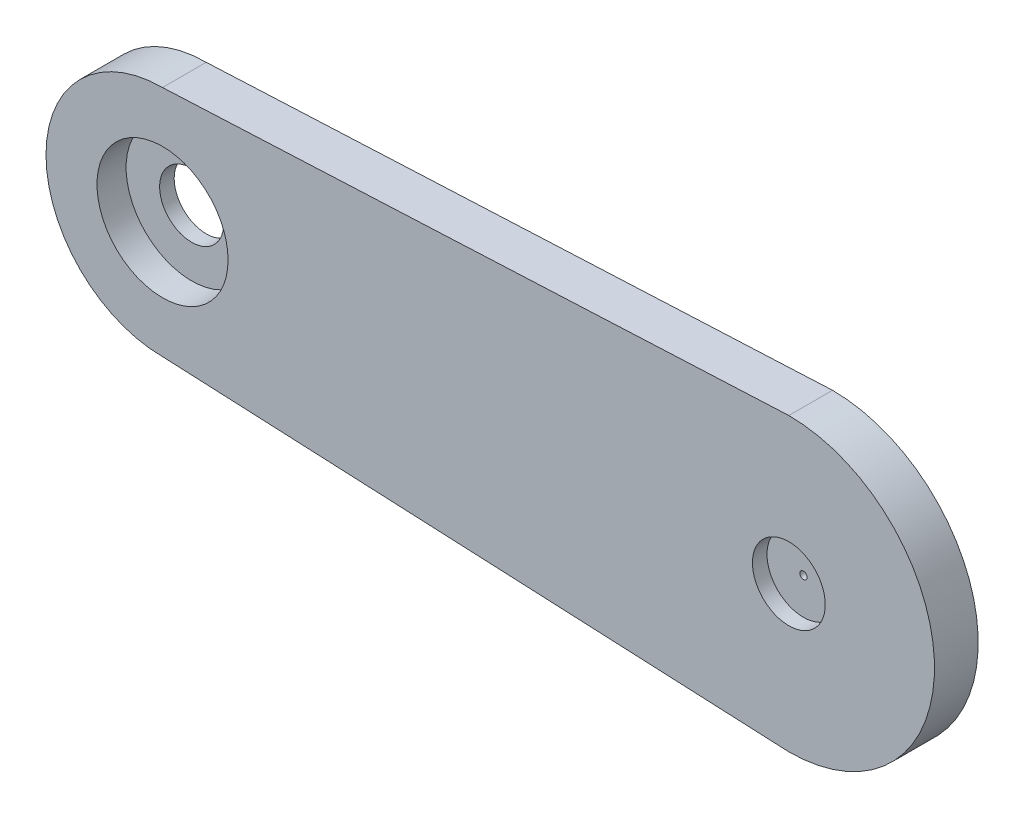
ISO-10303-21;
HEADER;
FILE_DESCRIPTION(('STEP AP214'),'2;1');
FILE_NAME('part.step','',(''),(''),'','','');
FILE_SCHEMA(('AUTOMOTIVE_DESIGN { 1 0 10303 214 1 1 1 1 }'));
ENDSEC;
DATA;
#1=APPLICATION_CONTEXT('core data for automotive mechanical design processes');
#2=APPLICATION_PROTOCOL_DEFINITION('international standard','automotive_design',2000,#1);
#3=PRODUCT_CONTEXT('',#1,'mechanical');
#4=PRODUCT('Part','Part','',(#3));
#5=PRODUCT_RELATED_PRODUCT_CATEGORY('part','',(#4));
#6=PRODUCT_DEFINITION_FORMATION('','',#4);
#7=PRODUCT_DEFINITION_CONTEXT('part definition',#1,'design');
#8=PRODUCT_DEFINITION('design','',#6,#7);
#9=PRODUCT_DEFINITION_SHAPE('','',#8);
#10=(LENGTH_UNIT() NAMED_UNIT(*) SI_UNIT(.MILLI.,.METRE.));
#11=(NAMED_UNIT(*) PLANE_ANGLE_UNIT() SI_UNIT($,.RADIAN.));
#12=(NAMED_UNIT(*) SI_UNIT($,.STERADIAN.) SOLID_ANGLE_UNIT());
#13=UNCERTAINTY_MEASURE_WITH_UNIT(LENGTH_MEASURE(1.E-05),#10,'distance_accuracy_value','');
#14=(GEOMETRIC_REPRESENTATION_CONTEXT(3) GLOBAL_UNCERTAINTY_ASSIGNED_CONTEXT((#13)) GLOBAL_UNIT_ASSIGNED_CONTEXT((#10,
#11,#12)) REPRESENTATION_CONTEXT('',''));
#15=CARTESIAN_POINT('',(0.,0.,0.));
#16=DIRECTION('',(0.,0.,1.));
#17=DIRECTION('',(1.,0.,0.));
#18=AXIS2_PLACEMENT_3D('',#15,#16,#17);
#19=CARTESIAN_POINT('',(215.,0.,15.));
#20=DIRECTION('',(0.,0.,-1.));
#21=DIRECTION('',(-1.,0.,0.));
#22=AXIS2_PLACEMENT_3D('',#19,#20,#21);
#23=CYLINDRICAL_SURFACE('',#22,1.25000000000001);
#24=CARTESIAN_POINT('',(215.,0.,0.));
#25=DIRECTION('',(0.,0.,1.));
#26=DIRECTION('',(1.,0.,0.));
#27=AXIS2_PLACEMENT_3D('',#24,#25,#26);
#28=CIRCLE('',#27,1.25000000000001);
#29=CARTESIAN_POINT('',(216.25,0.,0.));
#30=VERTEX_POINT('',#29);
#31=EDGE_CURVE('E127',#30,#30,#28,.T.);
#32=ORIENTED_EDGE('',*,*,#31,.F.);
#33=EDGE_LOOP('',(#32));
#34=FACE_BOUND('',#33,.T.);
#35=CARTESIAN_POINT('',(215.,0.,10.));
#36=DIRECTION('',(0.,0.,1.));
#37=DIRECTION('',(1.,0.,0.));
#38=AXIS2_PLACEMENT_3D('',#35,#36,#37);
#39=CIRCLE('',#38,1.25000000000001);
#40=CARTESIAN_POINT('',(216.25,0.,10.));
#41=VERTEX_POINT('',#40);
#42=EDGE_CURVE('E49',#41,#41,#39,.T.);
#43=ORIENTED_EDGE('',*,*,#42,.T.);
#44=EDGE_LOOP('',(#43));
#45=FACE_BOUND('',#44,.T.);
#46=ADVANCED_FACE('F45',(#34,#45),#23,.F.);
#47=CARTESIAN_POINT('',(-1.856449001619,-39.9136535348084,15.));
#48=DIRECTION('',(0.0464613993524682,0.998920086078066,0.));
#49=DIRECTION('',(-0.998920086078066,0.0464613993524682,0.));
#50=AXIS2_PLACEMENT_3D('',#47,#48,#49);
#51=PLANE('',#50);
#52=DIRECTION('',(0.998920086078066,-0.0464613993524682,0.));
#53=VECTOR('',#52,1.);
#54=CARTESIAN_POINT('',(-1.856449001619,-39.9136535348084,0.));
#55=LINE('',#54,#53);
#56=CARTESIAN_POINT('',(0.,-40.,0.));
#57=VERTEX_POINT('',#56);
#58=CARTESIAN_POINT('',(215.,-50.,0.));
#59=VERTEX_POINT('',#58);
#60=EDGE_CURVE('E115',#57,#59,#55,.T.);
#61=ORIENTED_EDGE('',*,*,#60,.T.);
#62=DIRECTION('',(0.,0.,-1.));
#63=VECTOR('',#62,1.);
#64=CARTESIAN_POINT('',(215.,-50.,15.));
#65=LINE('',#64,#63);
#66=CARTESIAN_POINT('',(215.,-50.,15.));
#67=VERTEX_POINT('',#66);
#68=EDGE_CURVE('E11',#67,#59,#65,.T.);
#69=ORIENTED_EDGE('',*,*,#68,.F.);
#70=DIRECTION('',(0.998920086078066,-0.0464613993524682,0.));
#71=VECTOR('',#70,1.);
#72=CARTESIAN_POINT('',(-1.856449001619,-39.9136535348084,15.));
#73=LINE('',#72,#71);
#74=CARTESIAN_POINT('',(0.,-40.,15.));
#75=VERTEX_POINT('',#74);
#76=EDGE_CURVE('E95',#75,#67,#73,.T.);
#77=ORIENTED_EDGE('',*,*,#76,.F.);
#78=DIRECTION('',(0.,0.,-1.));
#79=VECTOR('',#78,1.);
#80=CARTESIAN_POINT('',(0.,-40.,15.));
#81=LINE('',#80,#79);
#82=EDGE_CURVE('E111',#75,#57,#81,.T.);
#83=ORIENTED_EDGE('',*,*,#82,.T.);
#84=EDGE_LOOP('',(#61,#69,#77,#83));
#85=FACE_BOUND('',#84,.T.);
#86=ADVANCED_FACE('F47',(#85),#51,.F.);
#87=CARTESIAN_POINT('',(215.,0.,15.));
#88=DIRECTION('',(0.,0.,-1.));
#89=DIRECTION('',(-1.,0.,0.));
#90=AXIS2_PLACEMENT_3D('',#87,#88,#89);
#91=CYLINDRICAL_SURFACE('',#90,50.);
#92=CARTESIAN_POINT('',(215.,0.,0.));
#93=DIRECTION('',(0.,0.,1.));
#94=DIRECTION('',(1.,0.,0.));
#95=AXIS2_PLACEMENT_3D('',#92,#93,#94);
#96=CIRCLE('',#95,50.);
#97=CARTESIAN_POINT('',(215.,50.,0.));
#98=VERTEX_POINT('',#97);
#99=EDGE_CURVE('E101',#59,#98,#96,.T.);
#100=ORIENTED_EDGE('',*,*,#99,.T.);
#101=DIRECTION('',(0.,0.,-1.));
#102=VECTOR('',#101,1.);
#103=CARTESIAN_POINT('',(215.,50.,15.));
#104=LINE('',#103,#102);
#105=CARTESIAN_POINT('',(215.,50.,15.));
#106=VERTEX_POINT('',#105);
#107=EDGE_CURVE('E56',#106,#98,#104,.T.);
#108=ORIENTED_EDGE('',*,*,#107,.F.);
#109=CARTESIAN_POINT('',(215.,0.,15.));
#110=DIRECTION('',(0.,0.,1.));
#111=DIRECTION('',(1.,0.,0.));
#112=AXIS2_PLACEMENT_3D('',#109,#110,#111);
#113=CIRCLE('',#112,50.);
#114=EDGE_CURVE('E90',#67,#106,#113,.T.);
#115=ORIENTED_EDGE('',*,*,#114,.F.);
#116=ORIENTED_EDGE('',*,*,#68,.T.);
#117=EDGE_LOOP('',(#100,#108,#115,#116));
#118=FACE_BOUND('',#117,.T.);
#119=ADVANCED_FACE('F100',(#118),#91,.T.);
#120=CARTESIAN_POINT('',(-1.856449001619,39.9136535348084,15.));
#121=DIRECTION('',(-0.0464613993524682,0.998920086078066,0.));
#122=DIRECTION('',(-0.998920086078066,-0.0464613993524682,0.));
#123=AXIS2_PLACEMENT_3D('',#120,#121,#122);
#124=PLANE('',#123);
#125=DIRECTION('',(0.998920086078066,0.0464613993524682,0.));
#126=VECTOR('',#125,1.);
#127=CARTESIAN_POINT('',(-1.856449001619,39.9136535348084,0.));
#128=LINE('',#127,#126);
#129=CARTESIAN_POINT('',(0.,40.,0.));
#130=VERTEX_POINT('',#129);
#131=EDGE_CURVE('E122',#130,#98,#128,.T.);
#132=ORIENTED_EDGE('',*,*,#131,.F.);
#133=DIRECTION('',(0.,0.,-1.));
#134=VECTOR('',#133,1.);
#135=CARTESIAN_POINT('',(0.,40.,15.));
#136=LINE('',#135,#134);
#137=CARTESIAN_POINT('',(0.,40.,15.));
#138=VERTEX_POINT('',#137);
#139=EDGE_CURVE('E80',#138,#130,#136,.T.);
#140=ORIENTED_EDGE('',*,*,#139,.F.);
#141=DIRECTION('',(0.998920086078066,0.0464613993524682,0.));
#142=VECTOR('',#141,1.);
#143=CARTESIAN_POINT('',(-1.856449001619,39.9136535348084,15.));
#144=LINE('',#143,#142);
#145=EDGE_CURVE('E93',#138,#106,#144,.T.);
#146=ORIENTED_EDGE('',*,*,#145,.T.);
#147=ORIENTED_EDGE('',*,*,#107,.T.);
#148=EDGE_LOOP('',(#132,#140,#146,#147));
#149=FACE_BOUND('',#148,.T.);
#150=ADVANCED_FACE('F107',(#149),#124,.T.);
#151=CARTESIAN_POINT('',(0.,0.,15.));
#152=DIRECTION('',(0.,0.,-1.));
#153=DIRECTION('',(-1.,0.,0.));
#154=AXIS2_PLACEMENT_3D('',#151,#152,#153);
#155=CYLINDRICAL_SURFACE('',#154,40.);
#156=CARTESIAN_POINT('',(0.,0.,0.));
#157=DIRECTION('',(0.,0.,1.));
#158=DIRECTION('',(1.,0.,0.));
#159=AXIS2_PLACEMENT_3D('',#156,#157,#158);
#160=CIRCLE('',#159,40.);
#161=EDGE_CURVE('E83',#130,#57,#160,.T.);
#162=ORIENTED_EDGE('',*,*,#161,.T.);
#163=ORIENTED_EDGE('',*,*,#82,.F.);
#164=CARTESIAN_POINT('',(0.,0.,15.));
#165=DIRECTION('',(0.,0.,1.));
#166=DIRECTION('',(1.,0.,0.));
#167=AXIS2_PLACEMENT_3D('',#164,#165,#166);
#168=CIRCLE('',#167,40.);
#169=EDGE_CURVE('E64',#138,#75,#168,.T.);
#170=ORIENTED_EDGE('',*,*,#169,.F.);
#171=ORIENTED_EDGE('',*,*,#139,.T.);
#172=EDGE_LOOP('',(#162,#163,#170,#171));
#173=FACE_BOUND('',#172,.T.);
#174=ADVANCED_FACE('F191',(#173),#155,.T.);
#175=CARTESIAN_POINT('',(0.,0.,15.));
#176=DIRECTION('',(0.,0.,1.));
#177=DIRECTION('',(1.,0.,0.));
#178=AXIS2_PLACEMENT_3D('',#175,#176,#177);
#179=PLANE('',#178);
#180=CARTESIAN_POINT('',(0.,0.,15.));
#181=DIRECTION('',(0.,0.,1.));
#182=DIRECTION('',(1.,0.,0.));
#183=AXIS2_PLACEMENT_3D('',#180,#181,#182);
#184=CIRCLE('',#183,22.5);
#185=CARTESIAN_POINT('',(22.5,0.,15.));
#186=VERTEX_POINT('',#185);
#187=EDGE_CURVE('E172',#186,#186,#184,.T.);
#188=ORIENTED_EDGE('',*,*,#187,.F.);
#189=EDGE_LOOP('',(#188));
#190=FACE_BOUND('',#189,.T.);
#191=CARTESIAN_POINT('',(215.,0.,15.));
#192=DIRECTION('',(0.,0.,1.));
#193=DIRECTION('',(1.,0.,0.));
#194=AXIS2_PLACEMENT_3D('',#191,#192,#193);
#195=CIRCLE('',#194,12.5);
#196=CARTESIAN_POINT('',(227.5,0.,15.));
#197=VERTEX_POINT('',#196);
#198=EDGE_CURVE('E158',#197,#197,#195,.T.);
#199=ORIENTED_EDGE('',*,*,#198,.F.);
#200=EDGE_LOOP('',(#199));
#201=FACE_BOUND('',#200,.T.);
#202=ORIENTED_EDGE('',*,*,#76,.T.);
#203=ORIENTED_EDGE('',*,*,#114,.T.);
#204=ORIENTED_EDGE('',*,*,#145,.F.);
#205=ORIENTED_EDGE('',*,*,#169,.T.);
#206=EDGE_LOOP('',(#202,#203,#204,#205));
#207=FACE_BOUND('',#206,.T.);
#208=ADVANCED_FACE('F91',(#190,#201,#207),#179,.T.);
#209=CARTESIAN_POINT('',(0.,0.,0.));
#210=DIRECTION('',(0.,0.,1.));
#211=DIRECTION('',(1.,0.,0.));
#212=AXIS2_PLACEMENT_3D('',#209,#210,#211);
#213=PLANE('',#212);
#214=CARTESIAN_POINT('',(0.,0.,0.));
#215=DIRECTION('',(0.,0.,-1.));
#216=DIRECTION('',(-1.,0.,0.));
#217=AXIS2_PLACEMENT_3D('',#214,#215,#216);
#218=CIRCLE('',#217,11.);
#219=CARTESIAN_POINT('',(-11.,0.,0.));
#220=VERTEX_POINT('',#219);
#221=EDGE_CURVE('E119',#220,#220,#218,.T.);
#222=ORIENTED_EDGE('',*,*,#221,.F.);
#223=EDGE_LOOP('',(#222));
#224=FACE_BOUND('',#223,.T.);
#225=ORIENTED_EDGE('',*,*,#60,.F.);
#226=ORIENTED_EDGE('',*,*,#161,.F.);
#227=ORIENTED_EDGE('',*,*,#131,.T.);
#228=ORIENTED_EDGE('',*,*,#99,.F.);
#229=EDGE_LOOP('',(#225,#226,#227,#228));
#230=FACE_BOUND('',#229,.T.);
#231=ORIENTED_EDGE('',*,*,#31,.T.);
#232=EDGE_LOOP('',(#231));
#233=FACE_BOUND('',#232,.T.);
#234=ADVANCED_FACE('F137',(#224,#230,#233),#213,.F.);
#235=CARTESIAN_POINT('',(0.,0.,5.));
#236=DIRECTION('',(0.,0.,-1.));
#237=DIRECTION('',(-1.,0.,0.));
#238=AXIS2_PLACEMENT_3D('',#235,#236,#237);
#239=CYLINDRICAL_SURFACE('',#238,11.);
#240=CARTESIAN_POINT('',(0.,0.,5.));
#241=DIRECTION('',(0.,0.,1.));
#242=DIRECTION('',(1.,0.,0.));
#243=AXIS2_PLACEMENT_3D('',#240,#241,#242);
#244=CIRCLE('',#243,11.);
#245=CARTESIAN_POINT('',(11.,0.,5.));
#246=VERTEX_POINT('',#245);
#247=EDGE_CURVE('E164',#246,#246,#244,.F.);
#248=ORIENTED_EDGE('',*,*,#247,.F.);
#249=EDGE_LOOP('',(#248));
#250=FACE_BOUND('',#249,.T.);
#251=ORIENTED_EDGE('',*,*,#221,.T.);
#252=EDGE_LOOP('',(#251));
#253=FACE_BOUND('',#252,.T.);
#254=ADVANCED_FACE('F140',(#250,#253),#239,.F.);
#255=CARTESIAN_POINT('',(215.,0.,10.));
#256=DIRECTION('',(0.,0.,1.));
#257=DIRECTION('',(1.,0.,0.));
#258=AXIS2_PLACEMENT_3D('',#255,#256,#257);
#259=CYLINDRICAL_SURFACE('',#258,12.5);
#260=CARTESIAN_POINT('',(215.,0.,10.));
#261=DIRECTION('',(0.,0.,1.));
#262=DIRECTION('',(1.,0.,0.));
#263=AXIS2_PLACEMENT_3D('',#260,#261,#262);
#264=CIRCLE('',#263,12.5);
#265=CARTESIAN_POINT('',(227.5,0.,10.));
#266=VERTEX_POINT('',#265);
#267=EDGE_CURVE('E152',#266,#266,#264,.T.);
#268=ORIENTED_EDGE('',*,*,#267,.F.);
#269=EDGE_LOOP('',(#268));
#270=FACE_BOUND('',#269,.T.);
#271=ORIENTED_EDGE('',*,*,#198,.T.);
#272=EDGE_LOOP('',(#271));
#273=FACE_BOUND('',#272,.T.);
#274=ADVANCED_FACE('F195',(#270,#273),#259,.F.);
#275=CARTESIAN_POINT('',(215.,0.,10.));
#276=DIRECTION('',(0.,0.,1.));
#277=DIRECTION('',(1.,0.,0.));
#278=AXIS2_PLACEMENT_3D('',#275,#276,#277);
#279=PLANE('',#278);
#280=ORIENTED_EDGE('',*,*,#42,.F.);
#281=EDGE_LOOP('',(#280));
#282=FACE_BOUND('',#281,.T.);
#283=ORIENTED_EDGE('',*,*,#267,.T.);
#284=EDGE_LOOP('',(#283));
#285=FACE_BOUND('',#284,.T.);
#286=ADVANCED_FACE('F197',(#282,#285),#279,.T.);
#287=CARTESIAN_POINT('',(0.,0.,5.));
#288=DIRECTION('',(0.,0.,1.));
#289=DIRECTION('',(1.,0.,0.));
#290=AXIS2_PLACEMENT_3D('',#287,#288,#289);
#291=PLANE('',#290);
#292=CARTESIAN_POINT('',(0.,0.,5.));
#293=DIRECTION('',(0.,0.,1.));
#294=DIRECTION('',(1.,0.,0.));
#295=AXIS2_PLACEMENT_3D('',#292,#293,#294);
#296=CIRCLE('',#295,22.5);
#297=CARTESIAN_POINT('',(22.5,0.,5.));
#298=VERTEX_POINT('',#297);
#299=EDGE_CURVE('E171',#298,#298,#296,.T.);
#300=ORIENTED_EDGE('',*,*,#299,.T.);
#301=EDGE_LOOP('',(#300));
#302=FACE_BOUND('',#301,.T.);
#303=ORIENTED_EDGE('',*,*,#247,.T.);
#304=EDGE_LOOP('',(#303));
#305=FACE_BOUND('',#304,.T.);
#306=ADVANCED_FACE('F180',(#302,#305),#291,.T.);
#307=CARTESIAN_POINT('',(0.,0.,5.));
#308=DIRECTION('',(0.,0.,1.));
#309=DIRECTION('',(1.,0.,0.));
#310=AXIS2_PLACEMENT_3D('',#307,#308,#309);
#311=CYLINDRICAL_SURFACE('',#310,22.5);
#312=ORIENTED_EDGE('',*,*,#299,.F.);
#313=EDGE_LOOP('',(#312));
#314=FACE_BOUND('',#313,.T.);
#315=ORIENTED_EDGE('',*,*,#187,.T.);
#316=EDGE_LOOP('',(#315));
#317=FACE_BOUND('',#316,.T.);
#318=ADVANCED_FACE('F183',(#314,#317),#311,.F.);
#319=CLOSED_SHELL('',(#46,#86,#119,#150,#174,#208,#234,#254,#274,#286,#306,#318));
#320=MANIFOLD_SOLID_BREP('B2',#319);
#321=ADVANCED_BREP_SHAPE_REPRESENTATION('',(#18,#320),#14);
#322=SHAPE_DEFINITION_REPRESENTATION(#9,#321);
ENDSEC;
END-ISO-10303-21;
